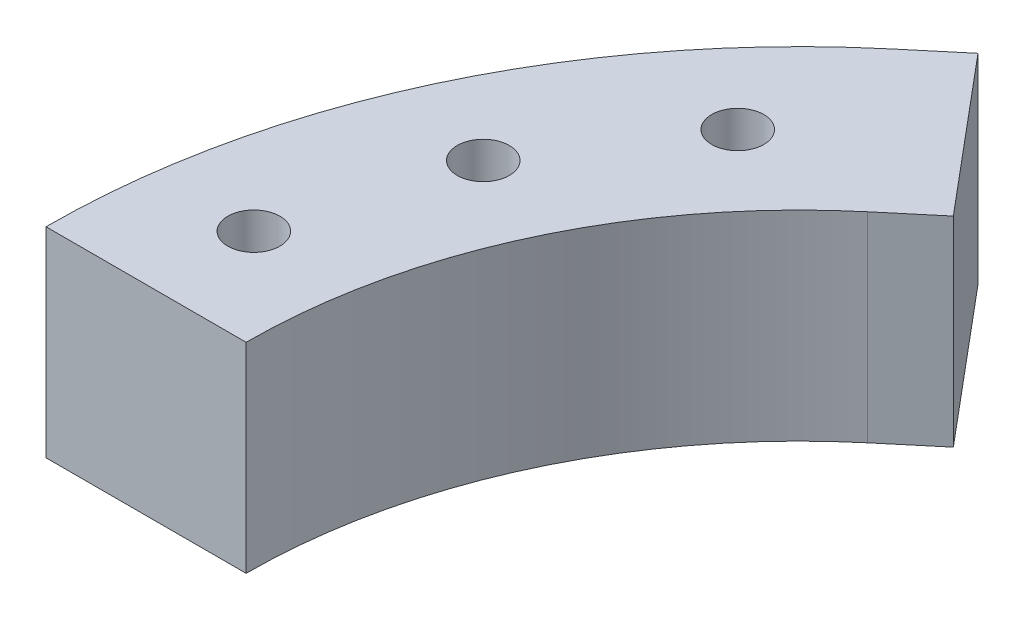
ISO-10303-21;
HEADER;
FILE_DESCRIPTION(('STEP AP214'),'2;1');
FILE_NAME('part.step','',(''),(''),'','','');
FILE_SCHEMA(('AUTOMOTIVE_DESIGN { 1 0 10303 214 1 1 1 1 }'));
ENDSEC;
DATA;
#1=APPLICATION_CONTEXT('core data for automotive mechanical design processes');
#2=APPLICATION_PROTOCOL_DEFINITION('international standard','automotive_design',2000,#1);
#3=PRODUCT_CONTEXT('',#1,'mechanical');
#4=PRODUCT('Part','Part','',(#3));
#5=PRODUCT_RELATED_PRODUCT_CATEGORY('part','',(#4));
#6=PRODUCT_DEFINITION_FORMATION('','',#4);
#7=PRODUCT_DEFINITION_CONTEXT('part definition',#1,'design');
#8=PRODUCT_DEFINITION('design','',#6,#7);
#9=PRODUCT_DEFINITION_SHAPE('','',#8);
#10=(LENGTH_UNIT() NAMED_UNIT(*) SI_UNIT(.MILLI.,.METRE.));
#11=(NAMED_UNIT(*) PLANE_ANGLE_UNIT() SI_UNIT($,.RADIAN.));
#12=(NAMED_UNIT(*) SI_UNIT($,.STERADIAN.) SOLID_ANGLE_UNIT());
#13=UNCERTAINTY_MEASURE_WITH_UNIT(LENGTH_MEASURE(1.E-05),#10,'distance_accuracy_value','');
#14=(GEOMETRIC_REPRESENTATION_CONTEXT(3) GLOBAL_UNCERTAINTY_ASSIGNED_CONTEXT((#13)) GLOBAL_UNIT_ASSIGNED_CONTEXT((#10,
#11,#12)) REPRESENTATION_CONTEXT('',''));
#15=CARTESIAN_POINT('',(0.,0.,0.));
#16=DIRECTION('',(0.,0.,1.));
#17=DIRECTION('',(1.,0.,0.));
#18=AXIS2_PLACEMENT_3D('',#15,#16,#17);
#19=CARTESIAN_POINT('',(65.2703644666136,20.,0.));
#20=DIRECTION('',(0.,-1.,0.));
#21=DIRECTION('',(0.,0.,-1.));
#22=AXIS2_PLACEMENT_3D('',#19,#20,#21);
#23=PLANE('',#22);
#24=CARTESIAN_POINT('',(65.2703644666136,20.,0.));
#25=DIRECTION('',(0.,-1.,0.));
#26=DIRECTION('',(0.,0.,-1.));
#27=AXIS2_PLACEMENT_3D('',#24,#25,#26);
#28=CIRCLE('',#27,55.2703644666136);
#29=CARTESIAN_POINT('',(9.99999999999999,20.,0.));
#30=VERTEX_POINT('',#29);
#31=CARTESIAN_POINT('',(29.7432590046155,20.,-42.3395555688102));
#32=VERTEX_POINT('',#31);
#33=EDGE_CURVE('E77',#30,#32,#28,.T.);
#34=ORIENTED_EDGE('',*,*,#33,.T.);
#35=DIRECTION('',(0.766044443118983,0.,-0.642787609686534));
#36=VECTOR('',#35,1.);
#37=CARTESIAN_POINT('',(29.7432590046155,20.,-42.3395555688102));
#38=LINE('',#37,#36);
#39=CARTESIAN_POINT('',(34.4161301076413,20.,-46.260559987898));
#40=VERTEX_POINT('',#39);
#41=EDGE_CURVE('E152',#32,#40,#38,.T.);
#42=ORIENTED_EDGE('',*,*,#41,.T.);
#43=DIRECTION('',(-0.642787609686535,0.,-0.766044443118982));
#44=VECTOR('',#43,1.);
#45=CARTESIAN_POINT('',(21.5603779139106,20.,-61.5814488502777));
#46=LINE('',#45,#44);
#47=CARTESIAN_POINT('',(21.5603779139106,20.,-61.5814488502777));
#48=VERTEX_POINT('',#47);
#49=EDGE_CURVE('E134',#40,#48,#46,.T.);
#50=ORIENTED_EDGE('',*,*,#49,.T.);
#51=DIRECTION('',(-0.766044443118983,0.,0.642787609686533));
#52=VECTOR('',#51,1.);
#53=CARTESIAN_POINT('',(16.8875068108848,20.,-57.6604444311898));
#54=LINE('',#53,#52);
#55=CARTESIAN_POINT('',(16.8875068108848,20.,-57.6604444311898));
#56=VERTEX_POINT('',#55);
#57=EDGE_CURVE('E122',#48,#56,#54,.T.);
#58=ORIENTED_EDGE('',*,*,#57,.T.);
#59=CARTESIAN_POINT('',(65.2703644666136,20.,0.));
#60=DIRECTION('',(0.,1.,0.));
#61=DIRECTION('',(0.,0.,-1.));
#62=AXIS2_PLACEMENT_3D('',#59,#60,#61);
#63=CIRCLE('',#62,75.2703644666136);
#64=CARTESIAN_POINT('',(-9.99999999999999,20.,0.));
#65=VERTEX_POINT('',#64);
#66=EDGE_CURVE('E103',#56,#65,#63,.T.);
#67=ORIENTED_EDGE('',*,*,#66,.T.);
#68=DIRECTION('',(1.,0.,0.));
#69=VECTOR('',#68,1.);
#70=CARTESIAN_POINT('',(9.99999999999999,20.,0.));
#71=LINE('',#70,#69);
#72=EDGE_CURVE('E50',#65,#30,#71,.T.);
#73=ORIENTED_EDGE('',*,*,#72,.T.);
#74=EDGE_LOOP('',(#34,#42,#50,#58,#67,#73));
#75=FACE_BOUND('',#74,.T.);
#76=CARTESIAN_POINT('',(6.11532488780152,20.,-27.5844479740623));
#77=DIRECTION('',(0.,1.,0.));
#78=DIRECTION('',(0.,0.,1.));
#79=AXIS2_PLACEMENT_3D('',#76,#77,#78);
#80=CIRCLE('',#79,2.60000000000009);
#81=CARTESIAN_POINT('',(6.11532488780152,20.,-24.9844479740622));
#82=VERTEX_POINT('',#81);
#83=EDGE_CURVE('E91',#82,#82,#80,.T.);
#84=ORIENTED_EDGE('',*,*,#83,.F.);
#85=EDGE_LOOP('',(#84));
#86=FACE_BOUND('',#85,.T.);
#87=CARTESIAN_POINT('',(0.770593322798101,20.,-10.));
#88=DIRECTION('',(0.,1.,0.));
#89=DIRECTION('',(0.,0.,1.));
#90=AXIS2_PLACEMENT_3D('',#87,#88,#89);
#91=CIRCLE('',#90,2.6);
#92=CARTESIAN_POINT('',(0.770593322798101,20.,-7.4));
#93=VERTEX_POINT('',#92);
#94=EDGE_CURVE('E142',#93,#93,#91,.T.);
#95=ORIENTED_EDGE('',*,*,#94,.F.);
#96=EDGE_LOOP('',(#95));
#97=FACE_BOUND('',#96,.T.);
#98=CARTESIAN_POINT('',(16.1502663165621,20.,-42.9818151703006));
#99=DIRECTION('',(0.,1.,0.));
#100=DIRECTION('',(0.,0.,1.));
#101=AXIS2_PLACEMENT_3D('',#98,#99,#100);
#102=CIRCLE('',#101,2.60000000000034);
#103=CARTESIAN_POINT('',(16.1502663165621,20.,-40.3818151703002));
#104=VERTEX_POINT('',#103);
#105=EDGE_CURVE('E136',#104,#104,#102,.T.);
#106=ORIENTED_EDGE('',*,*,#105,.F.);
#107=EDGE_LOOP('',(#106));
#108=FACE_BOUND('',#107,.T.);
#109=ADVANCED_FACE('F33',(#75,#86,#97,#108),#23,.F.);
#110=CARTESIAN_POINT('',(65.2703644666136,0.,0.));
#111=DIRECTION('',(0.,-1.,0.));
#112=DIRECTION('',(0.,0.,-1.));
#113=AXIS2_PLACEMENT_3D('',#110,#111,#112);
#114=PLANE('',#113);
#115=CARTESIAN_POINT('',(0.770593322798101,0.,-10.));
#116=DIRECTION('',(0.,1.,0.));
#117=DIRECTION('',(0.,0.,1.));
#118=AXIS2_PLACEMENT_3D('',#115,#116,#117);
#119=CIRCLE('',#118,2.6);
#120=CARTESIAN_POINT('',(0.770593322798101,0.,-7.4));
#121=VERTEX_POINT('',#120);
#122=EDGE_CURVE('E139',#121,#121,#119,.T.);
#123=ORIENTED_EDGE('',*,*,#122,.T.);
#124=EDGE_LOOP('',(#123));
#125=FACE_BOUND('',#124,.T.);
#126=CARTESIAN_POINT('',(65.2703644666136,0.,0.));
#127=DIRECTION('',(0.,-1.,0.));
#128=DIRECTION('',(0.,0.,-1.));
#129=AXIS2_PLACEMENT_3D('',#126,#127,#128);
#130=CIRCLE('',#129,55.2703644666136);
#131=CARTESIAN_POINT('',(9.99999999999999,0.,0.));
#132=VERTEX_POINT('',#131);
#133=CARTESIAN_POINT('',(29.7432590046155,0.,-42.3395555688102));
#134=VERTEX_POINT('',#133);
#135=EDGE_CURVE('E83',#132,#134,#130,.T.);
#136=ORIENTED_EDGE('',*,*,#135,.F.);
#137=DIRECTION('',(1.,0.,0.));
#138=VECTOR('',#137,1.);
#139=CARTESIAN_POINT('',(9.99999999999999,0.,0.));
#140=LINE('',#139,#138);
#141=CARTESIAN_POINT('',(-9.99999999999999,0.,0.));
#142=VERTEX_POINT('',#141);
#143=EDGE_CURVE('E69',#142,#132,#140,.T.);
#144=ORIENTED_EDGE('',*,*,#143,.F.);
#145=CARTESIAN_POINT('',(65.2703644666136,0.,0.));
#146=DIRECTION('',(0.,1.,0.));
#147=DIRECTION('',(0.,0.,-1.));
#148=AXIS2_PLACEMENT_3D('',#145,#146,#147);
#149=CIRCLE('',#148,75.2703644666136);
#150=CARTESIAN_POINT('',(16.8875068108848,0.,-57.6604444311898));
#151=VERTEX_POINT('',#150);
#152=EDGE_CURVE('E64',#151,#142,#149,.T.);
#153=ORIENTED_EDGE('',*,*,#152,.F.);
#154=DIRECTION('',(-0.766044443118983,0.,0.642787609686534));
#155=VECTOR('',#154,1.);
#156=CARTESIAN_POINT('',(16.8875068108848,0.,-57.6604444311898));
#157=LINE('',#156,#155);
#158=CARTESIAN_POINT('',(21.5603779139106,0.,-61.5814488502777));
#159=VERTEX_POINT('',#158);
#160=EDGE_CURVE('E109',#159,#151,#157,.T.);
#161=ORIENTED_EDGE('',*,*,#160,.F.);
#162=DIRECTION('',(-0.642787609686535,0.,-0.766044443118982));
#163=VECTOR('',#162,1.);
#164=CARTESIAN_POINT('',(21.5603779139106,0.,-61.5814488502777));
#165=LINE('',#164,#163);
#166=CARTESIAN_POINT('',(34.4161301076413,0.,-46.260559987898));
#167=VERTEX_POINT('',#166);
#168=EDGE_CURVE('E113',#167,#159,#165,.T.);
#169=ORIENTED_EDGE('',*,*,#168,.F.);
#170=DIRECTION('',(0.766044443118983,0.,-0.642787609686534));
#171=VECTOR('',#170,1.);
#172=CARTESIAN_POINT('',(29.7432590046155,0.,-42.3395555688102));
#173=LINE('',#172,#171);
#174=EDGE_CURVE('E90',#134,#167,#173,.T.);
#175=ORIENTED_EDGE('',*,*,#174,.F.);
#176=EDGE_LOOP('',(#136,#144,#153,#161,#169,#175));
#177=FACE_BOUND('',#176,.T.);
#178=CARTESIAN_POINT('',(6.11532488780152,0.,-27.5844479740623));
#179=DIRECTION('',(0.,1.,0.));
#180=DIRECTION('',(0.,0.,1.));
#181=AXIS2_PLACEMENT_3D('',#178,#179,#180);
#182=CIRCLE('',#181,2.60000000000009);
#183=CARTESIAN_POINT('',(6.11532488780152,0.,-24.9844479740622));
#184=VERTEX_POINT('',#183);
#185=EDGE_CURVE('E95',#184,#184,#182,.T.);
#186=ORIENTED_EDGE('',*,*,#185,.T.);
#187=EDGE_LOOP('',(#186));
#188=FACE_BOUND('',#187,.T.);
#189=CARTESIAN_POINT('',(16.1502663165621,0.,-42.9818151703006));
#190=DIRECTION('',(0.,1.,0.));
#191=DIRECTION('',(0.,0.,1.));
#192=AXIS2_PLACEMENT_3D('',#189,#190,#191);
#193=CIRCLE('',#192,2.60000000000034);
#194=CARTESIAN_POINT('',(16.1502663165621,0.,-40.3818151703002));
#195=VERTEX_POINT('',#194);
#196=EDGE_CURVE('E116',#195,#195,#193,.T.);
#197=ORIENTED_EDGE('',*,*,#196,.T.);
#198=EDGE_LOOP('',(#197));
#199=FACE_BOUND('',#198,.T.);
#200=ADVANCED_FACE('F86',(#125,#177,#188,#199),#114,.T.);
#201=CARTESIAN_POINT('',(65.2703644666136,20.,0.));
#202=DIRECTION('',(0.,-1.,0.));
#203=DIRECTION('',(0.,0.,-1.));
#204=AXIS2_PLACEMENT_3D('',#201,#202,#203);
#205=CYLINDRICAL_SURFACE('',#204,55.2703644666136);
#206=ORIENTED_EDGE('',*,*,#135,.T.);
#207=DIRECTION('',(0.,-1.,0.));
#208=VECTOR('',#207,1.);
#209=CARTESIAN_POINT('',(29.7432590046155,20.,-42.3395555688102));
#210=LINE('',#209,#208);
#211=EDGE_CURVE('E11',#32,#134,#210,.T.);
#212=ORIENTED_EDGE('',*,*,#211,.F.);
#213=ORIENTED_EDGE('',*,*,#33,.F.);
#214=DIRECTION('',(0.,-1.,0.));
#215=VECTOR('',#214,1.);
#216=CARTESIAN_POINT('',(9.99999999999999,20.,0.));
#217=LINE('',#216,#215);
#218=EDGE_CURVE('E72',#30,#132,#217,.T.);
#219=ORIENTED_EDGE('',*,*,#218,.T.);
#220=EDGE_LOOP('',(#206,#212,#213,#219));
#221=FACE_BOUND('',#220,.T.);
#222=ADVANCED_FACE('F35',(#221),#205,.F.);
#223=CARTESIAN_POINT('',(65.2703644666136,20.,0.));
#224=DIRECTION('',(0.,-1.,0.));
#225=DIRECTION('',(0.,0.,-1.));
#226=AXIS2_PLACEMENT_3D('',#223,#224,#225);
#227=CYLINDRICAL_SURFACE('',#226,75.2703644666136);
#228=ORIENTED_EDGE('',*,*,#152,.T.);
#229=DIRECTION('',(0.,-1.,0.));
#230=VECTOR('',#229,1.);
#231=CARTESIAN_POINT('',(-9.99999999999999,20.,0.));
#232=LINE('',#231,#230);
#233=EDGE_CURVE('E74',#65,#142,#232,.T.);
#234=ORIENTED_EDGE('',*,*,#233,.F.);
#235=ORIENTED_EDGE('',*,*,#66,.F.);
#236=DIRECTION('',(0.,-1.,0.));
#237=VECTOR('',#236,1.);
#238=CARTESIAN_POINT('',(16.8875068108848,20.,-57.6604444311898));
#239=LINE('',#238,#237);
#240=EDGE_CURVE('E42',#56,#151,#239,.T.);
#241=ORIENTED_EDGE('',*,*,#240,.T.);
#242=EDGE_LOOP('',(#228,#234,#235,#241));
#243=FACE_BOUND('',#242,.T.);
#244=ADVANCED_FACE('F102',(#243),#227,.T.);
#245=CARTESIAN_POINT('',(9.99999999999999,20.,0.));
#246=DIRECTION('',(0.,0.,-1.));
#247=DIRECTION('',(-1.,0.,0.));
#248=AXIS2_PLACEMENT_3D('',#245,#246,#247);
#249=PLANE('',#248);
#250=ORIENTED_EDGE('',*,*,#143,.T.);
#251=ORIENTED_EDGE('',*,*,#218,.F.);
#252=ORIENTED_EDGE('',*,*,#72,.F.);
#253=ORIENTED_EDGE('',*,*,#233,.T.);
#254=EDGE_LOOP('',(#250,#251,#252,#253));
#255=FACE_BOUND('',#254,.T.);
#256=ADVANCED_FACE('F71',(#255),#249,.F.);
#257=CARTESIAN_POINT('',(6.11532488780152,20.,-27.5844479740623));
#258=DIRECTION('',(0.,-1.,0.));
#259=DIRECTION('',(0.,0.,-1.));
#260=AXIS2_PLACEMENT_3D('',#257,#258,#259);
#261=CYLINDRICAL_SURFACE('',#260,2.60000000000009);
#262=ORIENTED_EDGE('',*,*,#83,.T.);
#263=EDGE_LOOP('',(#262));
#264=FACE_BOUND('',#263,.T.);
#265=ORIENTED_EDGE('',*,*,#185,.F.);
#266=EDGE_LOOP('',(#265));
#267=FACE_BOUND('',#266,.T.);
#268=ADVANCED_FACE('F183',(#264,#267),#261,.F.);
#269=CARTESIAN_POINT('',(0.770593322798101,20.,-10.));
#270=DIRECTION('',(0.,-1.,0.));
#271=DIRECTION('',(0.,0.,-1.));
#272=AXIS2_PLACEMENT_3D('',#269,#270,#271);
#273=CYLINDRICAL_SURFACE('',#272,2.6);
#274=ORIENTED_EDGE('',*,*,#94,.T.);
#275=EDGE_LOOP('',(#274));
#276=FACE_BOUND('',#275,.T.);
#277=ORIENTED_EDGE('',*,*,#122,.F.);
#278=EDGE_LOOP('',(#277));
#279=FACE_BOUND('',#278,.T.);
#280=ADVANCED_FACE('F173',(#276,#279),#273,.F.);
#281=CARTESIAN_POINT('',(16.1502663165621,20.,-42.9818151703006));
#282=DIRECTION('',(0.,-1.,0.));
#283=DIRECTION('',(0.,0.,-1.));
#284=AXIS2_PLACEMENT_3D('',#281,#282,#283);
#285=CYLINDRICAL_SURFACE('',#284,2.60000000000034);
#286=ORIENTED_EDGE('',*,*,#105,.T.);
#287=EDGE_LOOP('',(#286));
#288=FACE_BOUND('',#287,.T.);
#289=ORIENTED_EDGE('',*,*,#196,.F.);
#290=EDGE_LOOP('',(#289));
#291=FACE_BOUND('',#290,.T.);
#292=ADVANCED_FACE('F165',(#288,#291),#285,.F.);
#293=CARTESIAN_POINT('',(29.7432590046155,-26.0288895601594,-42.3395555688102));
#294=DIRECTION('',(0.642787609686534,0.,0.766044443118983));
#295=DIRECTION('',(0.766044443118983,0.,-0.642787609686534));
#296=AXIS2_PLACEMENT_3D('',#293,#294,#295);
#297=PLANE('',#296);
#298=ORIENTED_EDGE('',*,*,#211,.T.);
#299=ORIENTED_EDGE('',*,*,#174,.T.);
#300=DIRECTION('',(0.,1.,0.));
#301=VECTOR('',#300,1.);
#302=CARTESIAN_POINT('',(34.4161301076413,-26.0288895601594,-46.260559987898));
#303=LINE('',#302,#301);
#304=EDGE_CURVE('E129',#167,#40,#303,.T.);
#305=ORIENTED_EDGE('',*,*,#304,.T.);
#306=ORIENTED_EDGE('',*,*,#41,.F.);
#307=EDGE_LOOP('',(#298,#299,#305,#306));
#308=FACE_BOUND('',#307,.T.);
#309=ADVANCED_FACE('F160',(#308),#297,.T.);
#310=CARTESIAN_POINT('',(21.5603779139106,-26.0288895601594,-61.5814488502777));
#311=DIRECTION('',(0.766044443118982,0.,-0.642787609686535));
#312=DIRECTION('',(-0.642787609686535,0.,-0.766044443118982));
#313=AXIS2_PLACEMENT_3D('',#310,#311,#312);
#314=PLANE('',#313);
#315=ORIENTED_EDGE('',*,*,#304,.F.);
#316=ORIENTED_EDGE('',*,*,#168,.T.);
#317=DIRECTION('',(0.,1.,0.));
#318=VECTOR('',#317,1.);
#319=CARTESIAN_POINT('',(21.5603779139106,-26.0288895601594,-61.5814488502777));
#320=LINE('',#319,#318);
#321=EDGE_CURVE('E117',#159,#48,#320,.T.);
#322=ORIENTED_EDGE('',*,*,#321,.T.);
#323=ORIENTED_EDGE('',*,*,#49,.F.);
#324=EDGE_LOOP('',(#315,#316,#322,#323));
#325=FACE_BOUND('',#324,.T.);
#326=ADVANCED_FACE('F127',(#325),#314,.T.);
#327=CARTESIAN_POINT('',(16.8875068108848,-26.0288895601594,-57.6604444311898));
#328=DIRECTION('',(-0.642787609686533,0.,-0.766044443118983));
#329=DIRECTION('',(-0.766044443118983,0.,0.642787609686534));
#330=AXIS2_PLACEMENT_3D('',#327,#328,#329);
#331=PLANE('',#330);
#332=ORIENTED_EDGE('',*,*,#321,.F.);
#333=ORIENTED_EDGE('',*,*,#160,.T.);
#334=ORIENTED_EDGE('',*,*,#240,.F.);
#335=ORIENTED_EDGE('',*,*,#57,.F.);
#336=EDGE_LOOP('',(#332,#333,#334,#335));
#337=FACE_BOUND('',#336,.T.);
#338=ADVANCED_FACE('F120',(#337),#331,.T.);
#339=CLOSED_SHELL('',(#109,#200,#222,#244,#256,#268,#280,#292,#309,#326,#338));
#340=MANIFOLD_SOLID_BREP('B2',#339);
#341=ADVANCED_BREP_SHAPE_REPRESENTATION('',(#18,#340),#14);
#342=SHAPE_DEFINITION_REPRESENTATION(#9,#341);
ENDSEC;
END-ISO-10303-21;
